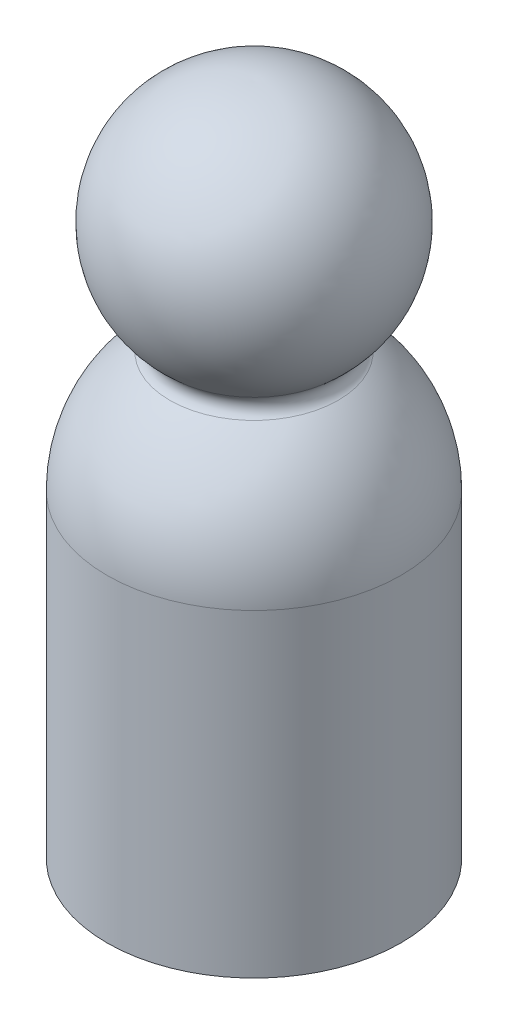
ISO-10303-21;
HEADER;
FILE_DESCRIPTION(('STEP AP214'),'2;1');
FILE_NAME('part.step','',(''),(''),'','','');
FILE_SCHEMA(('AUTOMOTIVE_DESIGN { 1 0 10303 214 1 1 1 1 }'));
ENDSEC;
DATA;
#1=APPLICATION_CONTEXT('core data for automotive mechanical design processes');
#2=APPLICATION_PROTOCOL_DEFINITION('international standard','automotive_design',2000,#1);
#3=PRODUCT_CONTEXT('',#1,'mechanical');
#4=PRODUCT('Part','Part','',(#3));
#5=PRODUCT_RELATED_PRODUCT_CATEGORY('part','',(#4));
#6=PRODUCT_DEFINITION_FORMATION('','',#4);
#7=PRODUCT_DEFINITION_CONTEXT('part definition',#1,'design');
#8=PRODUCT_DEFINITION('design','',#6,#7);
#9=PRODUCT_DEFINITION_SHAPE('','',#8);
#10=(LENGTH_UNIT() NAMED_UNIT(*) SI_UNIT(.MILLI.,.METRE.));
#11=(NAMED_UNIT(*) PLANE_ANGLE_UNIT() SI_UNIT($,.RADIAN.));
#12=(NAMED_UNIT(*) SI_UNIT($,.STERADIAN.) SOLID_ANGLE_UNIT());
#13=UNCERTAINTY_MEASURE_WITH_UNIT(LENGTH_MEASURE(1.E-05),#10,'distance_accuracy_value','');
#14=(GEOMETRIC_REPRESENTATION_CONTEXT(3) GLOBAL_UNCERTAINTY_ASSIGNED_CONTEXT((#13)) GLOBAL_UNIT_ASSIGNED_CONTEXT((#10,
#11,#12)) REPRESENTATION_CONTEXT('',''));
#15=CARTESIAN_POINT('',(0.,0.,0.));
#16=DIRECTION('',(0.,0.,1.));
#17=DIRECTION('',(1.,0.,0.));
#18=AXIS2_PLACEMENT_3D('',#15,#16,#17);
#19=CARTESIAN_POINT('',(0.,-3.75540294375101,0.));
#20=DIRECTION('',(0.,-1.,0.));
#21=DIRECTION('',(0.,0.,-1.));
#22=AXIS2_PLACEMENT_3D('',#19,#20,#21);
#23=PLANE('',#22);
#24=CARTESIAN_POINT('',(0.,-3.75540294375101,0.));
#25=DIRECTION('',(0.,-1.,0.));
#26=DIRECTION('',(0.,0.,-1.));
#27=AXIS2_PLACEMENT_3D('',#24,#25,#26);
#28=CIRCLE('',#27,12.);
#29=CARTESIAN_POINT('',(0.,-3.75540294375101,-12.));
#30=VERTEX_POINT('',#29);
#31=EDGE_CURVE('E57',#30,#30,#28,.T.);
#32=ORIENTED_EDGE('',*,*,#31,.T.);
#33=EDGE_LOOP('',(#32));
#34=FACE_BOUND('',#33,.T.);
#35=ADVANCED_FACE('F33',(#34),#23,.T.);
#36=CARTESIAN_POINT('',(0.,41.244597056249,-0.296414741949221));
#37=DIRECTION('',(-1.,0.,0.));
#38=DIRECTION('',(0.,0.,-1.));
#39=AXIS2_PLACEMENT_3D('',#36,#37,#38);
#40=CIRCLE('',#39,10.);
#41=TRIMMED_CURVE('',#40,(PARAMETER_VALUE(-1.6004421432907)),(PARAMETER_VALUE(1.6004421432907)),
.T.,.PARAMETER.);
#42=CARTESIAN_POINT('',(0.,41.244597056249,0.));
#43=DIRECTION('',(0.,-1.,0.));
#44=AXIS1_PLACEMENT('',#42,#43);
#45=SURFACE_OF_REVOLUTION('',#41,#44);
#46=CARTESIAN_POINT('',(0.,51.2402030059028,0.));
#47=VERTEX_POINT('',#46);
#48=VERTEX_LOOP('',#47);
#49=FACE_BOUND('',#48,.T.);
#50=CARTESIAN_POINT('',(0.,33.6529122831515,0.));
#51=DIRECTION('',(0.,-1.,0.));
#52=DIRECTION('',(0.,0.,-1.));
#53=AXIS2_PLACEMENT_3D('',#50,#51,#52);
#54=CIRCLE('',#53,6.80535646130115);
#55=CARTESIAN_POINT('',(0.,33.6529122831515,-6.80535646130115));
#56=VERTEX_POINT('',#55);
#57=EDGE_CURVE('E11',#56,#56,#54,.T.);
#58=ORIENTED_EDGE('',*,*,#57,.F.);
#59=EDGE_LOOP('',(#58));
#60=FACE_BOUND('',#59,.T.);
#61=ADVANCED_FACE('F42',(#49,#60),#45,.T.);
#62=CARTESIAN_POINT('',(0.,32.8937438058418,0.));
#63=DIRECTION('',(0.,-1.,0.));
#64=DIRECTION('',(0.,0.,-1.));
#65=AXIS2_PLACEMENT_3D('',#62,#63,#64);
#66=TOROIDAL_SURFACE('',#65,7.45625063323635,1.);
#67=ORIENTED_EDGE('',*,*,#57,.T.);
#68=EDGE_LOOP('',(#67));
#69=FACE_BOUND('',#68,.T.);
#70=CARTESIAN_POINT('',(0.,32.0745786712577,0.));
#71=DIRECTION('',(0.,-1.,0.));
#72=DIRECTION('',(0.,0.,-1.));
#73=AXIS2_PLACEMENT_3D('',#70,#71,#72);
#74=CIRCLE('',#73,6.88269289221817);
#75=CARTESIAN_POINT('',(0.,32.0745786712577,-6.88269289221817));
#76=VERTEX_POINT('',#75);
#77=EDGE_CURVE('E39',#76,#76,#74,.T.);
#78=ORIENTED_EDGE('',*,*,#77,.F.);
#79=EDGE_LOOP('',(#78));
#80=FACE_BOUND('',#79,.T.);
#81=ADVANCED_FACE('F45',(#69,#80),#66,.F.);
#82=CARTESIAN_POINT('',(0.,22.244597056249,0.));
#83=DIRECTION('',(0.,-1.,0.));
#84=DIRECTION('',(1.,0.,0.));
#85=AXIS2_PLACEMENT_3D('',#82,#83,#84);
#86=SPHERICAL_SURFACE('',#85,12.);
#87=ORIENTED_EDGE('',*,*,#77,.T.);
#88=EDGE_LOOP('',(#87));
#89=FACE_BOUND('',#88,.T.);
#90=CARTESIAN_POINT('',(0.,22.244597056249,0.));
#91=DIRECTION('',(0.,-1.,0.));
#92=DIRECTION('',(0.,0.,-1.));
#93=AXIS2_PLACEMENT_3D('',#90,#91,#92);
#94=CIRCLE('',#93,12.);
#95=CARTESIAN_POINT('',(0.,22.244597056249,-12.));
#96=VERTEX_POINT('',#95);
#97=EDGE_CURVE('E55',#96,#96,#94,.T.);
#98=ORIENTED_EDGE('',*,*,#97,.F.);
#99=EDGE_LOOP('',(#98));
#100=FACE_BOUND('',#99,.T.);
#101=ADVANCED_FACE('F50',(#89,#100),#86,.T.);
#102=CARTESIAN_POINT('',(0.,0.,0.));
#103=DIRECTION('',(0.,-1.,0.));
#104=DIRECTION('',(0.,0.,-1.));
#105=AXIS2_PLACEMENT_3D('',#102,#103,#104);
#106=CYLINDRICAL_SURFACE('',#105,12.);
#107=ORIENTED_EDGE('',*,*,#97,.T.);
#108=EDGE_LOOP('',(#107));
#109=FACE_BOUND('',#108,.T.);
#110=ORIENTED_EDGE('',*,*,#31,.F.);
#111=EDGE_LOOP('',(#110));
#112=FACE_BOUND('',#111,.T.);
#113=ADVANCED_FACE('F64',(#109,#112),#106,.T.);
#114=CLOSED_SHELL('',(#35,#61,#81,#101,#113));
#115=MANIFOLD_SOLID_BREP('B2',#114);
#116=ADVANCED_BREP_SHAPE_REPRESENTATION('',(#18,#115),#14);
#117=SHAPE_DEFINITION_REPRESENTATION(#9,#116);
ENDSEC;
END-ISO-10303-21;
